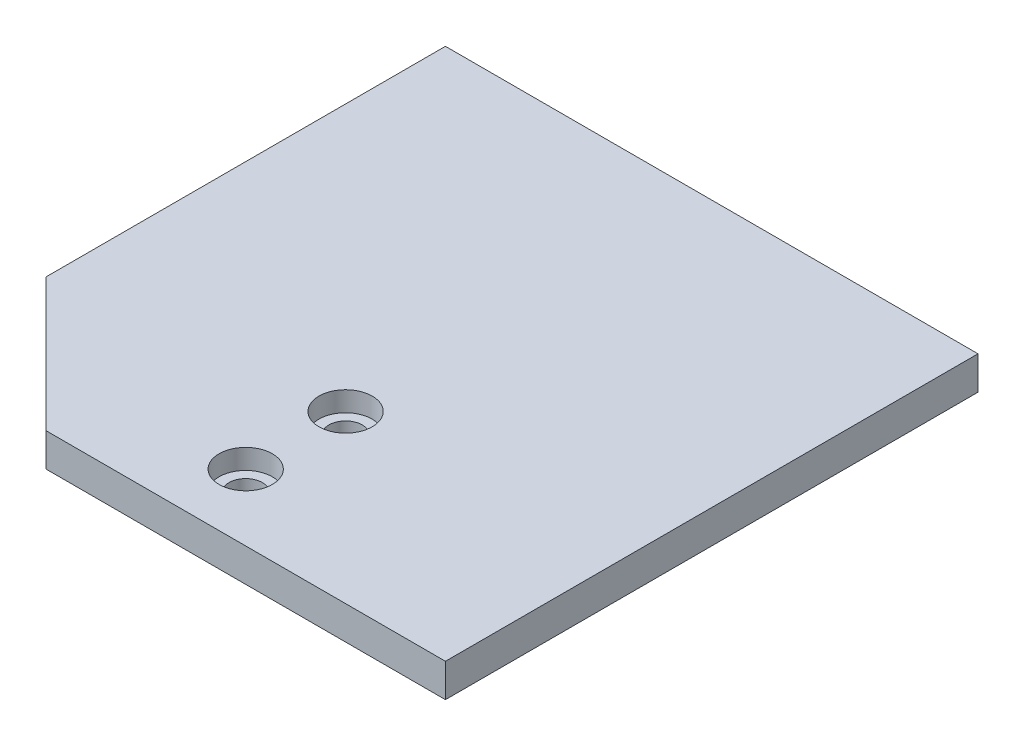
ISO-10303-21;
HEADER;
FILE_DESCRIPTION(('STEP AP214'),'2;1');
FILE_NAME('part.step','',(''),(''),'','','');
FILE_SCHEMA(('AUTOMOTIVE_DESIGN { 1 0 10303 214 1 1 1 1 }'));
ENDSEC;
DATA;
#1=APPLICATION_CONTEXT('core data for automotive mechanical design processes');
#2=APPLICATION_PROTOCOL_DEFINITION('international standard','automotive_design',2000,#1);
#3=PRODUCT_CONTEXT('',#1,'mechanical');
#4=PRODUCT('Part','Part','',(#3));
#5=PRODUCT_RELATED_PRODUCT_CATEGORY('part','',(#4));
#6=PRODUCT_DEFINITION_FORMATION('','',#4);
#7=PRODUCT_DEFINITION_CONTEXT('part definition',#1,'design');
#8=PRODUCT_DEFINITION('design','',#6,#7);
#9=PRODUCT_DEFINITION_SHAPE('','',#8);
#10=(LENGTH_UNIT() NAMED_UNIT(*) SI_UNIT(.MILLI.,.METRE.));
#11=(NAMED_UNIT(*) PLANE_ANGLE_UNIT() SI_UNIT($,.RADIAN.));
#12=(NAMED_UNIT(*) SI_UNIT($,.STERADIAN.) SOLID_ANGLE_UNIT());
#13=UNCERTAINTY_MEASURE_WITH_UNIT(LENGTH_MEASURE(1.E-05),#10,'distance_accuracy_value','');
#14=(GEOMETRIC_REPRESENTATION_CONTEXT(3) GLOBAL_UNCERTAINTY_ASSIGNED_CONTEXT((#13)) GLOBAL_UNIT_ASSIGNED_CONTEXT((#10,
#11,#12)) REPRESENTATION_CONTEXT('',''));
#15=CARTESIAN_POINT('',(0.,0.,0.));
#16=DIRECTION('',(0.,0.,1.));
#17=DIRECTION('',(1.,0.,0.));
#18=AXIS2_PLACEMENT_3D('',#15,#16,#17);
#19=CARTESIAN_POINT('',(0.,-10.,30.));
#20=DIRECTION('',(0.,1.,0.));
#21=DIRECTION('',(0.,0.,1.));
#22=AXIS2_PLACEMENT_3D('',#19,#20,#21);
#23=CYLINDRICAL_SURFACE('',#22,2.5);
#24=CARTESIAN_POINT('',(0.,0.,30.));
#25=DIRECTION('',(0.,1.,0.));
#26=DIRECTION('',(0.,0.,1.));
#27=AXIS2_PLACEMENT_3D('',#24,#25,#26);
#28=CIRCLE('',#27,2.5);
#29=CARTESIAN_POINT('',(0.,0.,32.5));
#30=VERTEX_POINT('',#29);
#31=EDGE_CURVE('E125',#30,#30,#28,.T.);
#32=ORIENTED_EDGE('',*,*,#31,.F.);
#33=EDGE_LOOP('',(#32));
#34=FACE_BOUND('',#33,.T.);
#35=CARTESIAN_POINT('',(0.,2.,30.));
#36=DIRECTION('',(0.,1.,0.));
#37=DIRECTION('',(0.,0.,1.));
#38=AXIS2_PLACEMENT_3D('',#35,#36,#37);
#39=CIRCLE('',#38,2.5);
#40=CARTESIAN_POINT('',(0.,2.,32.5));
#41=VERTEX_POINT('',#40);
#42=EDGE_CURVE('E37',#41,#41,#39,.F.);
#43=ORIENTED_EDGE('',*,*,#42,.F.);
#44=EDGE_LOOP('',(#43));
#45=FACE_BOUND('',#44,.T.);
#46=ADVANCED_FACE('F33',(#34,#45),#23,.F.);
#47=CARTESIAN_POINT('',(0.,-10.,15.));
#48=DIRECTION('',(0.,1.,0.));
#49=DIRECTION('',(0.,0.,1.));
#50=AXIS2_PLACEMENT_3D('',#47,#48,#49);
#51=CYLINDRICAL_SURFACE('',#50,2.5);
#52=CARTESIAN_POINT('',(0.,0.,15.));
#53=DIRECTION('',(0.,1.,0.));
#54=DIRECTION('',(0.,0.,1.));
#55=AXIS2_PLACEMENT_3D('',#52,#53,#54);
#56=CIRCLE('',#55,2.5);
#57=CARTESIAN_POINT('',(0.,0.,17.5));
#58=VERTEX_POINT('',#57);
#59=EDGE_CURVE('E114',#58,#58,#56,.T.);
#60=ORIENTED_EDGE('',*,*,#59,.F.);
#61=EDGE_LOOP('',(#60));
#62=FACE_BOUND('',#61,.T.);
#63=CARTESIAN_POINT('',(0.,2.,15.));
#64=DIRECTION('',(0.,1.,0.));
#65=DIRECTION('',(0.,0.,1.));
#66=AXIS2_PLACEMENT_3D('',#63,#64,#65);
#67=CIRCLE('',#66,2.5);
#68=CARTESIAN_POINT('',(0.,2.,17.5));
#69=VERTEX_POINT('',#68);
#70=EDGE_CURVE('E127',#69,#69,#67,.F.);
#71=ORIENTED_EDGE('',*,*,#70,.F.);
#72=EDGE_LOOP('',(#71));
#73=FACE_BOUND('',#72,.T.);
#74=ADVANCED_FACE('F166',(#62,#73),#51,.F.);
#75=CARTESIAN_POINT('',(-40.,5.,20.));
#76=DIRECTION('',(1.,0.,0.));
#77=DIRECTION('',(0.,0.,-1.));
#78=AXIS2_PLACEMENT_3D('',#75,#76,#77);
#79=PLANE('',#78);
#80=DIRECTION('',(0.,0.,1.));
#81=VECTOR('',#80,1.);
#82=CARTESIAN_POINT('',(-40.,0.,20.));
#83=LINE('',#82,#81);
#84=CARTESIAN_POINT('',(-40.,0.,-40.));
#85=VERTEX_POINT('',#84);
#86=CARTESIAN_POINT('',(-40.,0.,20.));
#87=VERTEX_POINT('',#86);
#88=EDGE_CURVE('E110',#85,#87,#83,.T.);
#89=ORIENTED_EDGE('',*,*,#88,.T.);
#90=DIRECTION('',(0.,-1.,0.));
#91=VECTOR('',#90,1.);
#92=CARTESIAN_POINT('',(-40.,5.,20.));
#93=LINE('',#92,#91);
#94=CARTESIAN_POINT('',(-40.,5.,20.));
#95=VERTEX_POINT('',#94);
#96=EDGE_CURVE('E11',#95,#87,#93,.T.);
#97=ORIENTED_EDGE('',*,*,#96,.F.);
#98=DIRECTION('',(0.,0.,1.));
#99=VECTOR('',#98,1.);
#100=CARTESIAN_POINT('',(-40.,5.,20.));
#101=LINE('',#100,#99);
#102=CARTESIAN_POINT('',(-40.,5.,-40.));
#103=VERTEX_POINT('',#102);
#104=EDGE_CURVE('E119',#103,#95,#101,.T.);
#105=ORIENTED_EDGE('',*,*,#104,.F.);
#106=DIRECTION('',(0.,-1.,0.));
#107=VECTOR('',#106,1.);
#108=CARTESIAN_POINT('',(-40.,5.,-40.));
#109=LINE('',#108,#107);
#110=EDGE_CURVE('E106',#103,#85,#109,.T.);
#111=ORIENTED_EDGE('',*,*,#110,.T.);
#112=EDGE_LOOP('',(#89,#97,#105,#111));
#113=FACE_BOUND('',#112,.T.);
#114=ADVANCED_FACE('F35',(#113),#79,.F.);
#115=CARTESIAN_POINT('',(-20.,5.,40.));
#116=DIRECTION('',(0.707106781186548,0.,-0.707106781186548));
#117=DIRECTION('',(-0.707106781186548,0.,-0.707106781186548));
#118=AXIS2_PLACEMENT_3D('',#115,#116,#117);
#119=PLANE('',#118);
#120=DIRECTION('',(0.707106781186548,0.,0.707106781186548));
#121=VECTOR('',#120,1.);
#122=CARTESIAN_POINT('',(-20.,0.,40.));
#123=LINE('',#122,#121);
#124=CARTESIAN_POINT('',(-20.,0.,40.));
#125=VERTEX_POINT('',#124);
#126=EDGE_CURVE('E113',#87,#125,#123,.T.);
#127=ORIENTED_EDGE('',*,*,#126,.T.);
#128=DIRECTION('',(0.,-1.,0.));
#129=VECTOR('',#128,1.);
#130=CARTESIAN_POINT('',(-20.,5.,40.));
#131=LINE('',#130,#129);
#132=CARTESIAN_POINT('',(-20.,5.,40.));
#133=VERTEX_POINT('',#132);
#134=EDGE_CURVE('E43',#133,#125,#131,.T.);
#135=ORIENTED_EDGE('',*,*,#134,.F.);
#136=DIRECTION('',(0.707106781186548,0.,0.707106781186548));
#137=VECTOR('',#136,1.);
#138=CARTESIAN_POINT('',(-20.,5.,40.));
#139=LINE('',#138,#137);
#140=EDGE_CURVE('E86',#95,#133,#139,.T.);
#141=ORIENTED_EDGE('',*,*,#140,.F.);
#142=ORIENTED_EDGE('',*,*,#96,.T.);
#143=EDGE_LOOP('',(#127,#135,#141,#142));
#144=FACE_BOUND('',#143,.T.);
#145=ADVANCED_FACE('F147',(#144),#119,.F.);
#146=CARTESIAN_POINT('',(40.,5.,40.));
#147=DIRECTION('',(0.,0.,-1.));
#148=DIRECTION('',(-1.,0.,0.));
#149=AXIS2_PLACEMENT_3D('',#146,#147,#148);
#150=PLANE('',#149);
#151=DIRECTION('',(1.,0.,0.));
#152=VECTOR('',#151,1.);
#153=CARTESIAN_POINT('',(40.,0.,40.));
#154=LINE('',#153,#152);
#155=CARTESIAN_POINT('',(40.,0.,40.));
#156=VERTEX_POINT('',#155);
#157=EDGE_CURVE('E101',#125,#156,#154,.T.);
#158=ORIENTED_EDGE('',*,*,#157,.T.);
#159=DIRECTION('',(0.,-1.,0.));
#160=VECTOR('',#159,1.);
#161=CARTESIAN_POINT('',(40.,5.,40.));
#162=LINE('',#161,#160);
#163=CARTESIAN_POINT('',(40.,5.,40.));
#164=VERTEX_POINT('',#163);
#165=EDGE_CURVE('E98',#164,#156,#162,.T.);
#166=ORIENTED_EDGE('',*,*,#165,.F.);
#167=DIRECTION('',(1.,0.,0.));
#168=VECTOR('',#167,1.);
#169=CARTESIAN_POINT('',(40.,5.,40.));
#170=LINE('',#169,#168);
#171=EDGE_CURVE('E90',#133,#164,#170,.T.);
#172=ORIENTED_EDGE('',*,*,#171,.F.);
#173=ORIENTED_EDGE('',*,*,#134,.T.);
#174=EDGE_LOOP('',(#158,#166,#172,#173));
#175=FACE_BOUND('',#174,.T.);
#176=ADVANCED_FACE('F99',(#175),#150,.F.);
#177=CARTESIAN_POINT('',(40.,5.,40.));
#178=DIRECTION('',(-1.,0.,0.));
#179=DIRECTION('',(0.,0.,1.));
#180=AXIS2_PLACEMENT_3D('',#177,#178,#179);
#181=PLANE('',#180);
#182=DIRECTION('',(0.,0.,-1.));
#183=VECTOR('',#182,1.);
#184=CARTESIAN_POINT('',(40.,0.,40.));
#185=LINE('',#184,#183);
#186=CARTESIAN_POINT('',(40.,0.,-40.));
#187=VERTEX_POINT('',#186);
#188=EDGE_CURVE('E72',#156,#187,#185,.T.);
#189=ORIENTED_EDGE('',*,*,#188,.T.);
#190=DIRECTION('',(0.,-1.,0.));
#191=VECTOR('',#190,1.);
#192=CARTESIAN_POINT('',(40.,5.,-40.));
#193=LINE('',#192,#191);
#194=CARTESIAN_POINT('',(40.,5.,-40.));
#195=VERTEX_POINT('',#194);
#196=EDGE_CURVE('E102',#195,#187,#193,.T.);
#197=ORIENTED_EDGE('',*,*,#196,.F.);
#198=DIRECTION('',(0.,0.,-1.));
#199=VECTOR('',#198,1.);
#200=CARTESIAN_POINT('',(40.,5.,40.));
#201=LINE('',#200,#199);
#202=EDGE_CURVE('E94',#164,#195,#201,.T.);
#203=ORIENTED_EDGE('',*,*,#202,.F.);
#204=ORIENTED_EDGE('',*,*,#165,.T.);
#205=EDGE_LOOP('',(#189,#197,#203,#204));
#206=FACE_BOUND('',#205,.T.);
#207=ADVANCED_FACE('F104',(#206),#181,.F.);
#208=CARTESIAN_POINT('',(40.,5.,-40.));
#209=DIRECTION('',(0.,0.,1.));
#210=DIRECTION('',(1.,0.,0.));
#211=AXIS2_PLACEMENT_3D('',#208,#209,#210);
#212=PLANE('',#211);
#213=DIRECTION('',(-1.,0.,0.));
#214=VECTOR('',#213,1.);
#215=CARTESIAN_POINT('',(40.,0.,-40.));
#216=LINE('',#215,#214);
#217=EDGE_CURVE('E78',#187,#85,#216,.T.);
#218=ORIENTED_EDGE('',*,*,#217,.T.);
#219=ORIENTED_EDGE('',*,*,#110,.F.);
#220=DIRECTION('',(-1.,0.,0.));
#221=VECTOR('',#220,1.);
#222=CARTESIAN_POINT('',(40.,5.,-40.));
#223=LINE('',#222,#221);
#224=EDGE_CURVE('E52',#195,#103,#223,.T.);
#225=ORIENTED_EDGE('',*,*,#224,.F.);
#226=ORIENTED_EDGE('',*,*,#196,.T.);
#227=EDGE_LOOP('',(#218,#219,#225,#226));
#228=FACE_BOUND('',#227,.T.);
#229=ADVANCED_FACE('F160',(#228),#212,.F.);
#230=CARTESIAN_POINT('',(0.,5.,0.));
#231=DIRECTION('',(0.,1.,0.));
#232=DIRECTION('',(0.,0.,1.));
#233=AXIS2_PLACEMENT_3D('',#230,#231,#232);
#234=PLANE('',#233);
#235=CARTESIAN_POINT('',(0.,5.,30.));
#236=DIRECTION('',(0.,1.,0.));
#237=DIRECTION('',(0.,0.,1.));
#238=AXIS2_PLACEMENT_3D('',#235,#236,#237);
#239=CIRCLE('',#238,4.);
#240=CARTESIAN_POINT('',(0.,5.,34.));
#241=VERTEX_POINT('',#240);
#242=EDGE_CURVE('E140',#241,#241,#239,.T.);
#243=ORIENTED_EDGE('',*,*,#242,.F.);
#244=EDGE_LOOP('',(#243));
#245=FACE_BOUND('',#244,.T.);
#246=CARTESIAN_POINT('',(0.,5.,15.));
#247=DIRECTION('',(0.,1.,0.));
#248=DIRECTION('',(0.,0.,1.));
#249=AXIS2_PLACEMENT_3D('',#246,#247,#248);
#250=CIRCLE('',#249,4.);
#251=CARTESIAN_POINT('',(0.,5.,19.));
#252=VERTEX_POINT('',#251);
#253=EDGE_CURVE('E133',#252,#252,#250,.T.);
#254=ORIENTED_EDGE('',*,*,#253,.F.);
#255=EDGE_LOOP('',(#254));
#256=FACE_BOUND('',#255,.T.);
#257=ORIENTED_EDGE('',*,*,#104,.T.);
#258=ORIENTED_EDGE('',*,*,#140,.T.);
#259=ORIENTED_EDGE('',*,*,#171,.T.);
#260=ORIENTED_EDGE('',*,*,#202,.T.);
#261=ORIENTED_EDGE('',*,*,#224,.T.);
#262=EDGE_LOOP('',(#257,#258,#259,#260,#261));
#263=FACE_BOUND('',#262,.T.);
#264=ADVANCED_FACE('F92',(#245,#256,#263),#234,.T.);
#265=CARTESIAN_POINT('',(0.,0.,0.));
#266=DIRECTION('',(0.,1.,0.));
#267=DIRECTION('',(0.,0.,1.));
#268=AXIS2_PLACEMENT_3D('',#265,#266,#267);
#269=PLANE('',#268);
#270=ORIENTED_EDGE('',*,*,#31,.T.);
#271=EDGE_LOOP('',(#270));
#272=FACE_BOUND('',#271,.T.);
#273=ORIENTED_EDGE('',*,*,#59,.T.);
#274=EDGE_LOOP('',(#273));
#275=FACE_BOUND('',#274,.T.);
#276=ORIENTED_EDGE('',*,*,#88,.F.);
#277=ORIENTED_EDGE('',*,*,#217,.F.);
#278=ORIENTED_EDGE('',*,*,#188,.F.);
#279=ORIENTED_EDGE('',*,*,#157,.F.);
#280=ORIENTED_EDGE('',*,*,#126,.F.);
#281=EDGE_LOOP('',(#276,#277,#278,#279,#280));
#282=FACE_BOUND('',#281,.T.);
#283=ADVANCED_FACE('F149',(#272,#275,#282),#269,.F.);
#284=CARTESIAN_POINT('',(0.,2.,15.));
#285=DIRECTION('',(0.,1.,0.));
#286=DIRECTION('',(0.,0.,1.));
#287=AXIS2_PLACEMENT_3D('',#284,#285,#286);
#288=PLANE('',#287);
#289=CARTESIAN_POINT('',(0.,2.,15.));
#290=DIRECTION('',(0.,1.,0.));
#291=DIRECTION('',(0.,0.,1.));
#292=AXIS2_PLACEMENT_3D('',#289,#290,#291);
#293=CIRCLE('',#292,4.);
#294=CARTESIAN_POINT('',(0.,2.,19.));
#295=VERTEX_POINT('',#294);
#296=EDGE_CURVE('E129',#295,#295,#293,.T.);
#297=ORIENTED_EDGE('',*,*,#296,.T.);
#298=EDGE_LOOP('',(#297));
#299=FACE_BOUND('',#298,.T.);
#300=ORIENTED_EDGE('',*,*,#70,.T.);
#301=EDGE_LOOP('',(#300));
#302=FACE_BOUND('',#301,.T.);
#303=ADVANCED_FACE('F151',(#299,#302),#288,.T.);
#304=CARTESIAN_POINT('',(0.,2.,15.));
#305=DIRECTION('',(0.,1.,0.));
#306=DIRECTION('',(0.,0.,1.));
#307=AXIS2_PLACEMENT_3D('',#304,#305,#306);
#308=CYLINDRICAL_SURFACE('',#307,4.);
#309=ORIENTED_EDGE('',*,*,#296,.F.);
#310=EDGE_LOOP('',(#309));
#311=FACE_BOUND('',#310,.T.);
#312=ORIENTED_EDGE('',*,*,#253,.T.);
#313=EDGE_LOOP('',(#312));
#314=FACE_BOUND('',#313,.T.);
#315=ADVANCED_FACE('F158',(#311,#314),#308,.F.);
#316=CARTESIAN_POINT('',(0.,2.,30.));
#317=DIRECTION('',(0.,1.,0.));
#318=DIRECTION('',(0.,0.,1.));
#319=AXIS2_PLACEMENT_3D('',#316,#317,#318);
#320=PLANE('',#319);
#321=CARTESIAN_POINT('',(0.,2.,30.));
#322=DIRECTION('',(0.,1.,0.));
#323=DIRECTION('',(0.,0.,1.));
#324=AXIS2_PLACEMENT_3D('',#321,#322,#323);
#325=CIRCLE('',#324,4.);
#326=CARTESIAN_POINT('',(0.,2.,34.));
#327=VERTEX_POINT('',#326);
#328=EDGE_CURVE('E192',#327,#327,#325,.T.);
#329=ORIENTED_EDGE('',*,*,#328,.T.);
#330=EDGE_LOOP('',(#329));
#331=FACE_BOUND('',#330,.T.);
#332=ORIENTED_EDGE('',*,*,#42,.T.);
#333=EDGE_LOOP('',(#332));
#334=FACE_BOUND('',#333,.T.);
#335=ADVANCED_FACE('F178',(#331,#334),#320,.T.);
#336=CARTESIAN_POINT('',(0.,2.,30.));
#337=DIRECTION('',(0.,1.,0.));
#338=DIRECTION('',(0.,0.,1.));
#339=AXIS2_PLACEMENT_3D('',#336,#337,#338);
#340=CYLINDRICAL_SURFACE('',#339,4.);
#341=ORIENTED_EDGE('',*,*,#328,.F.);
#342=EDGE_LOOP('',(#341));
#343=FACE_BOUND('',#342,.T.);
#344=ORIENTED_EDGE('',*,*,#242,.T.);
#345=EDGE_LOOP('',(#344));
#346=FACE_BOUND('',#345,.T.);
#347=ADVANCED_FACE('F181',(#343,#346),#340,.F.);
#348=CLOSED_SHELL('',(#46,#74,#114,#145,#176,#207,#229,#264,#283,#303,#315,#335,#347));
#349=MANIFOLD_SOLID_BREP('B2',#348);
#350=ADVANCED_BREP_SHAPE_REPRESENTATION('',(#18,#349),#14);
#351=SHAPE_DEFINITION_REPRESENTATION(#9,#350);
ENDSEC;
END-ISO-10303-21;
